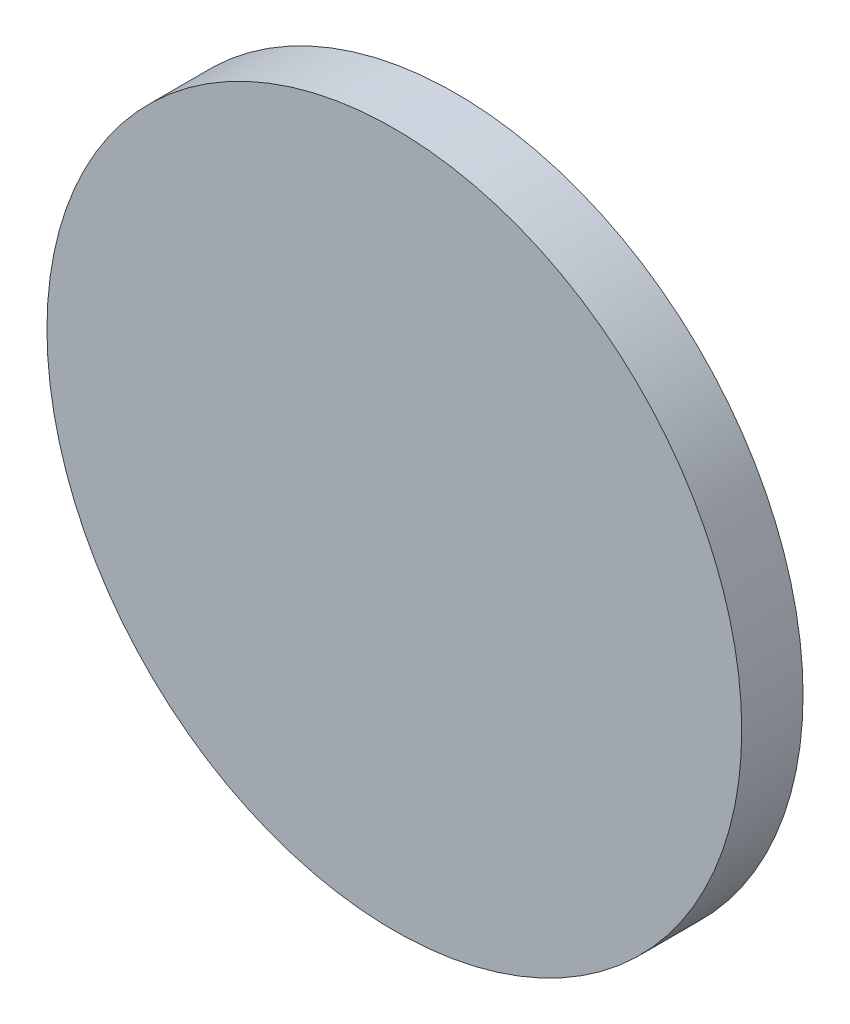
ISO-10303-21;
HEADER;
FILE_DESCRIPTION(('STEP AP214'),'2;1');
FILE_NAME('part.step','',(''),(''),'','','');
FILE_SCHEMA(('AUTOMOTIVE_DESIGN { 1 0 10303 214 1 1 1 1 }'));
ENDSEC;
DATA;
#1=APPLICATION_CONTEXT('core data for automotive mechanical design processes');
#2=APPLICATION_PROTOCOL_DEFINITION('international standard','automotive_design',2000,#1);
#3=PRODUCT_CONTEXT('',#1,'mechanical');
#4=PRODUCT('Part','Part','',(#3));
#5=PRODUCT_RELATED_PRODUCT_CATEGORY('part','',(#4));
#6=PRODUCT_DEFINITION_FORMATION('','',#4);
#7=PRODUCT_DEFINITION_CONTEXT('part definition',#1,'design');
#8=PRODUCT_DEFINITION('design','',#6,#7);
#9=PRODUCT_DEFINITION_SHAPE('','',#8);
#10=(LENGTH_UNIT() NAMED_UNIT(*) SI_UNIT(.MILLI.,.METRE.));
#11=(NAMED_UNIT(*) PLANE_ANGLE_UNIT() SI_UNIT($,.RADIAN.));
#12=(NAMED_UNIT(*) SI_UNIT($,.STERADIAN.) SOLID_ANGLE_UNIT());
#13=UNCERTAINTY_MEASURE_WITH_UNIT(LENGTH_MEASURE(1.E-05),#10,'distance_accuracy_value','');
#14=(GEOMETRIC_REPRESENTATION_CONTEXT(3) GLOBAL_UNCERTAINTY_ASSIGNED_CONTEXT((#13)) GLOBAL_UNIT_ASSIGNED_CONTEXT((#10,
#11,#12)) REPRESENTATION_CONTEXT('',''));
#15=CARTESIAN_POINT('',(0.,0.,0.));
#16=DIRECTION('',(0.,0.,1.));
#17=DIRECTION('',(1.,0.,0.));
#18=AXIS2_PLACEMENT_3D('',#15,#16,#17);
#19=CARTESIAN_POINT('',(48.2138,15.2499,2.7));
#20=DIRECTION('',(0.,0.,1.));
#21=DIRECTION('',(1.,0.,0.));
#22=AXIS2_PLACEMENT_3D('',#19,#20,#21);
#23=PLANE('',#22);
#24=CARTESIAN_POINT('',(48.21380000001,15.24990000001,2.70000000001));
#25=DIRECTION('',(0.,0.,1.));
#26=DIRECTION('',(-1.,0.,0.));
#27=AXIS2_PLACEMENT_3D('',#24,#25,#26);
#28=CIRCLE('',#27,0.17000000001);
#29=CARTESIAN_POINT('',(48.0438,15.24990000001,2.70000000001));
#30=VERTEX_POINT('',#29);
#31=EDGE_CURVE('E11',#30,#30,#28,.T.);
#32=ORIENTED_EDGE('',*,*,#31,.T.);
#33=EDGE_LOOP('',(#32));
#34=FACE_BOUND('',#33,.T.);
#35=ADVANCED_FACE('F17',(#34),#23,.T.);
#36=CARTESIAN_POINT('',(48.2138,15.2499,2.67));
#37=DIRECTION('',(0.,0.,1.));
#38=DIRECTION('',(1.,0.,0.));
#39=AXIS2_PLACEMENT_3D('',#36,#37,#38);
#40=PLANE('',#39);
#41=CARTESIAN_POINT('',(48.21380000001,15.24990000001,2.67000000001));
#42=DIRECTION('',(0.,0.,-1.));
#43=DIRECTION('',(1.,0.,0.));
#44=AXIS2_PLACEMENT_3D('',#41,#42,#43);
#45=CIRCLE('',#44,0.17000000001);
#46=CARTESIAN_POINT('',(48.38380000002,15.24990000001,2.67000000001));
#47=VERTEX_POINT('',#46);
#48=EDGE_CURVE('E25',#47,#47,#45,.T.);
#49=ORIENTED_EDGE('',*,*,#48,.T.);
#50=EDGE_LOOP('',(#49));
#51=FACE_BOUND('',#50,.T.);
#52=ADVANCED_FACE('F39',(#51),#40,.F.);
#53=CARTESIAN_POINT('',(48.2138,15.2499,2.67));
#54=DIRECTION('',(0.,0.,1.));
#55=DIRECTION('',(1.,0.,0.));
#56=AXIS2_PLACEMENT_3D('',#53,#54,#55);
#57=CYLINDRICAL_SURFACE('',#56,0.17);
#58=ORIENTED_EDGE('',*,*,#31,.F.);
#59=EDGE_LOOP('',(#58));
#60=FACE_BOUND('',#59,.T.);
#61=ORIENTED_EDGE('',*,*,#48,.F.);
#62=EDGE_LOOP('',(#61));
#63=FACE_BOUND('',#62,.T.);
#64=ADVANCED_FACE('F52',(#60,#63),#57,.T.);
#65=CLOSED_SHELL('',(#35,#52,#64));
#66=MANIFOLD_SOLID_BREP('B1',#65);
#67=ADVANCED_BREP_SHAPE_REPRESENTATION('',(#18,#66),#14);
#68=SHAPE_DEFINITION_REPRESENTATION(#9,#67);
ENDSEC;
END-ISO-10303-21;
